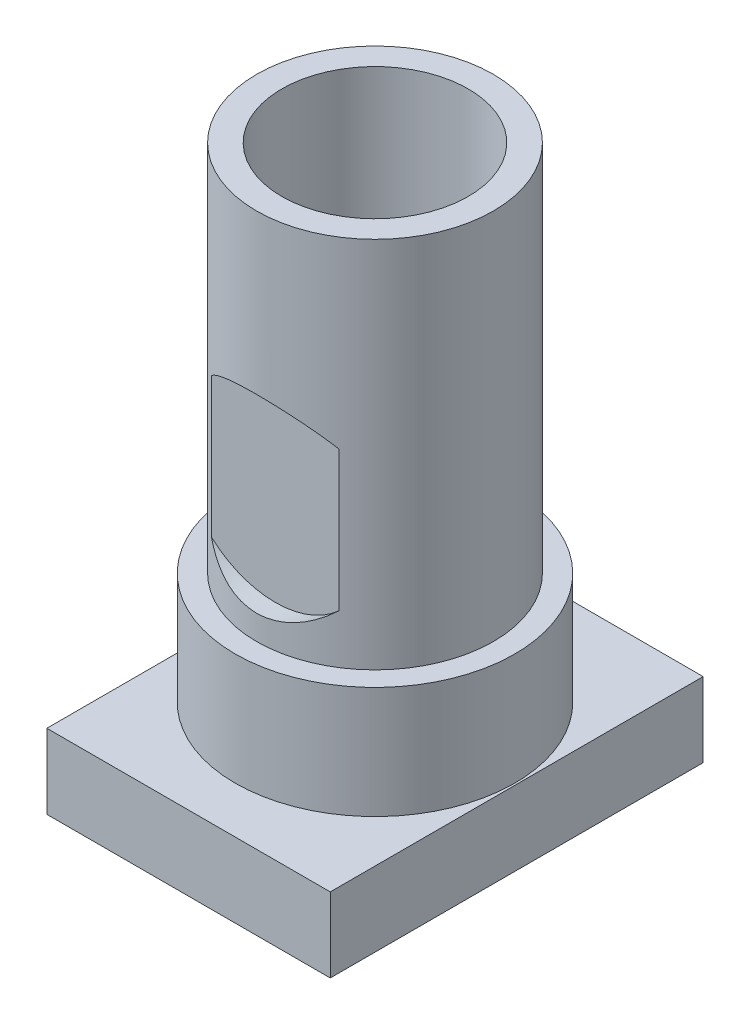
ISO-10303-21;
HEADER;
FILE_DESCRIPTION(('STEP AP214'),'2;1');
FILE_NAME('part.step','',(''),(''),'','','');
FILE_SCHEMA(('AUTOMOTIVE_DESIGN { 1 0 10303 214 1 1 1 1 }'));
ENDSEC;
DATA;
#1=APPLICATION_CONTEXT('core data for automotive mechanical design processes');
#2=APPLICATION_PROTOCOL_DEFINITION('international standard','automotive_design',2000,#1);
#3=PRODUCT_CONTEXT('',#1,'mechanical');
#4=PRODUCT('Part','Part','',(#3));
#5=PRODUCT_RELATED_PRODUCT_CATEGORY('part','',(#4));
#6=PRODUCT_DEFINITION_FORMATION('','',#4);
#7=PRODUCT_DEFINITION_CONTEXT('part definition',#1,'design');
#8=PRODUCT_DEFINITION('design','',#6,#7);
#9=PRODUCT_DEFINITION_SHAPE('','',#8);
#10=(LENGTH_UNIT() NAMED_UNIT(*) SI_UNIT(.MILLI.,.METRE.));
#11=(NAMED_UNIT(*) PLANE_ANGLE_UNIT() SI_UNIT($,.RADIAN.));
#12=(NAMED_UNIT(*) SI_UNIT($,.STERADIAN.) SOLID_ANGLE_UNIT());
#13=UNCERTAINTY_MEASURE_WITH_UNIT(LENGTH_MEASURE(1.E-05),#10,'distance_accuracy_value','');
#14=(GEOMETRIC_REPRESENTATION_CONTEXT(3) GLOBAL_UNCERTAINTY_ASSIGNED_CONTEXT((#13)) GLOBAL_UNIT_ASSIGNED_CONTEXT((#10,
#11,#12)) REPRESENTATION_CONTEXT('',''));
#15=CARTESIAN_POINT('',(0.,0.,0.));
#16=DIRECTION('',(0.,0.,1.));
#17=DIRECTION('',(1.,0.,0.));
#18=AXIS2_PLACEMENT_3D('',#15,#16,#17);
#19=CARTESIAN_POINT('',(0.,5.,0.));
#20=DIRECTION('',(0.,1.,0.));
#21=DIRECTION('',(0.,0.,1.));
#22=AXIS2_PLACEMENT_3D('',#19,#20,#21);
#23=PLANE('',#22);
#24=CARTESIAN_POINT('',(0.,5.,0.));
#25=DIRECTION('',(0.,1.,0.));
#26=DIRECTION('',(0.,0.,1.));
#27=AXIS2_PLACEMENT_3D('',#24,#25,#26);
#28=CIRCLE('',#27,3.75);
#29=CARTESIAN_POINT('',(0.,5.,3.75));
#30=VERTEX_POINT('',#29);
#31=EDGE_CURVE('E230',#30,#30,#28,.T.);
#32=ORIENTED_EDGE('',*,*,#31,.T.);
#33=EDGE_LOOP('',(#32));
#34=FACE_BOUND('',#33,.T.);
#35=CARTESIAN_POINT('',(0.,5.,0.));
#36=DIRECTION('',(0.,1.,0.));
#37=DIRECTION('',(0.,0.,1.));
#38=AXIS2_PLACEMENT_3D('',#35,#36,#37);
#39=CIRCLE('',#38,3.175);
#40=CARTESIAN_POINT('',(0.,5.,3.175));
#41=VERTEX_POINT('',#40);
#42=EDGE_CURVE('E224',#41,#41,#39,.T.);
#43=ORIENTED_EDGE('',*,*,#42,.F.);
#44=EDGE_LOOP('',(#43));
#45=FACE_BOUND('',#44,.T.);
#46=ADVANCED_FACE('F33',(#34,#45),#23,.T.);
#47=CARTESIAN_POINT('',(3.8,2.,-5.));
#48=DIRECTION('',(-1.,0.,0.));
#49=DIRECTION('',(0.,0.,1.));
#50=AXIS2_PLACEMENT_3D('',#47,#48,#49);
#51=PLANE('',#50);
#52=DIRECTION('',(0.,0.,-1.));
#53=VECTOR('',#52,1.);
#54=CARTESIAN_POINT('',(3.8,0.,-5.));
#55=LINE('',#54,#53);
#56=CARTESIAN_POINT('',(3.8,0.,5.));
#57=VERTEX_POINT('',#56);
#58=CARTESIAN_POINT('',(3.8,0.,-5.));
#59=VERTEX_POINT('',#58);
#60=EDGE_CURVE('E189',#57,#59,#55,.T.);
#61=ORIENTED_EDGE('',*,*,#60,.T.);
#62=DIRECTION('',(0.,-1.,0.));
#63=VECTOR('',#62,1.);
#64=CARTESIAN_POINT('',(3.8,2.,-5.));
#65=LINE('',#64,#63);
#66=CARTESIAN_POINT('',(3.8,2.,-5.));
#67=VERTEX_POINT('',#66);
#68=EDGE_CURVE('E183',#67,#59,#65,.T.);
#69=ORIENTED_EDGE('',*,*,#68,.F.);
#70=DIRECTION('',(0.,0.,-1.));
#71=VECTOR('',#70,1.);
#72=CARTESIAN_POINT('',(3.8,2.,-5.));
#73=LINE('',#72,#71);
#74=CARTESIAN_POINT('',(3.8,2.,5.));
#75=VERTEX_POINT('',#74);
#76=EDGE_CURVE('E196',#75,#67,#73,.T.);
#77=ORIENTED_EDGE('',*,*,#76,.F.);
#78=DIRECTION('',(0.,-1.,0.));
#79=VECTOR('',#78,1.);
#80=CARTESIAN_POINT('',(3.8,2.,5.));
#81=LINE('',#80,#79);
#82=EDGE_CURVE('E200',#75,#57,#81,.T.);
#83=ORIENTED_EDGE('',*,*,#82,.T.);
#84=EDGE_LOOP('',(#61,#69,#77,#83));
#85=FACE_BOUND('',#84,.T.);
#86=ADVANCED_FACE('F35',(#85),#51,.F.);
#87=CARTESIAN_POINT('',(-3.8,2.,-5.));
#88=DIRECTION('',(0.,0.,1.));
#89=DIRECTION('',(1.,0.,0.));
#90=AXIS2_PLACEMENT_3D('',#87,#88,#89);
#91=PLANE('',#90);
#92=DIRECTION('',(-1.,0.,0.));
#93=VECTOR('',#92,1.);
#94=CARTESIAN_POINT('',(-3.8,0.,-5.));
#95=LINE('',#94,#93);
#96=CARTESIAN_POINT('',(-3.8,0.,-5.));
#97=VERTEX_POINT('',#96);
#98=EDGE_CURVE('E178',#59,#97,#95,.T.);
#99=ORIENTED_EDGE('',*,*,#98,.T.);
#100=DIRECTION('',(0.,-1.,0.));
#101=VECTOR('',#100,1.);
#102=CARTESIAN_POINT('',(-3.8,2.,-5.));
#103=LINE('',#102,#101);
#104=CARTESIAN_POINT('',(-3.8,2.,-5.));
#105=VERTEX_POINT('',#104);
#106=EDGE_CURVE('E180',#105,#97,#103,.T.);
#107=ORIENTED_EDGE('',*,*,#106,.F.);
#108=DIRECTION('',(-1.,0.,0.));
#109=VECTOR('',#108,1.);
#110=CARTESIAN_POINT('',(-3.8,2.,-5.));
#111=LINE('',#110,#109);
#112=EDGE_CURVE('E85',#67,#105,#111,.T.);
#113=ORIENTED_EDGE('',*,*,#112,.F.);
#114=ORIENTED_EDGE('',*,*,#68,.T.);
#115=EDGE_LOOP('',(#99,#107,#113,#114));
#116=FACE_BOUND('',#115,.T.);
#117=ADVANCED_FACE('F157',(#116),#91,.F.);
#118=CARTESIAN_POINT('',(-3.8,2.,-5.));
#119=DIRECTION('',(1.,0.,0.));
#120=DIRECTION('',(0.,0.,-1.));
#121=AXIS2_PLACEMENT_3D('',#118,#119,#120);
#122=PLANE('',#121);
#123=DIRECTION('',(0.,0.,1.));
#124=VECTOR('',#123,1.);
#125=CARTESIAN_POINT('',(-3.8,0.,-5.));
#126=LINE('',#125,#124);
#127=CARTESIAN_POINT('',(-3.8,0.,5.));
#128=VERTEX_POINT('',#127);
#129=EDGE_CURVE('E188',#97,#128,#126,.T.);
#130=ORIENTED_EDGE('',*,*,#129,.T.);
#131=DIRECTION('',(0.,-1.,0.));
#132=VECTOR('',#131,1.);
#133=CARTESIAN_POINT('',(-3.8,2.,5.));
#134=LINE('',#133,#132);
#135=CARTESIAN_POINT('',(-3.8,2.,5.));
#136=VERTEX_POINT('',#135);
#137=EDGE_CURVE('E193',#136,#128,#134,.T.);
#138=ORIENTED_EDGE('',*,*,#137,.F.);
#139=DIRECTION('',(0.,0.,1.));
#140=VECTOR('',#139,1.);
#141=CARTESIAN_POINT('',(-3.8,2.,-5.));
#142=LINE('',#141,#140);
#143=EDGE_CURVE('E192',#105,#136,#142,.T.);
#144=ORIENTED_EDGE('',*,*,#143,.F.);
#145=ORIENTED_EDGE('',*,*,#106,.T.);
#146=EDGE_LOOP('',(#130,#138,#144,#145));
#147=FACE_BOUND('',#146,.T.);
#148=ADVANCED_FACE('F172',(#147),#122,.F.);
#149=CARTESIAN_POINT('',(-3.8,2.,5.));
#150=DIRECTION('',(0.,0.,-1.));
#151=DIRECTION('',(-1.,0.,0.));
#152=AXIS2_PLACEMENT_3D('',#149,#150,#151);
#153=PLANE('',#152);
#154=DIRECTION('',(1.,0.,0.));
#155=VECTOR('',#154,1.);
#156=CARTESIAN_POINT('',(-3.8,0.,5.));
#157=LINE('',#156,#155);
#158=EDGE_CURVE('E77',#128,#57,#157,.T.);
#159=ORIENTED_EDGE('',*,*,#158,.T.);
#160=ORIENTED_EDGE('',*,*,#82,.F.);
#161=DIRECTION('',(1.,0.,0.));
#162=VECTOR('',#161,1.);
#163=CARTESIAN_POINT('',(-3.8,2.,5.));
#164=LINE('',#163,#162);
#165=EDGE_CURVE('E56',#136,#75,#164,.T.);
#166=ORIENTED_EDGE('',*,*,#165,.F.);
#167=ORIENTED_EDGE('',*,*,#137,.T.);
#168=EDGE_LOOP('',(#159,#160,#166,#167));
#169=FACE_BOUND('',#168,.T.);
#170=ADVANCED_FACE('F165',(#169),#153,.F.);
#171=CARTESIAN_POINT('',(0.,2.,0.));
#172=DIRECTION('',(0.,1.,0.));
#173=DIRECTION('',(0.,0.,1.));
#174=AXIS2_PLACEMENT_3D('',#171,#172,#173);
#175=PLANE('',#174);
#176=CARTESIAN_POINT('',(0.,2.,0.));
#177=DIRECTION('',(0.,1.,0.));
#178=DIRECTION('',(0.,0.,1.));
#179=AXIS2_PLACEMENT_3D('',#176,#177,#178);
#180=CIRCLE('',#179,3.75);
#181=CARTESIAN_POINT('',(0.,2.,3.75));
#182=VERTEX_POINT('',#181);
#183=EDGE_CURVE('E227',#182,#182,#180,.T.);
#184=ORIENTED_EDGE('',*,*,#183,.F.);
#185=EDGE_LOOP('',(#184));
#186=FACE_BOUND('',#185,.T.);
#187=ORIENTED_EDGE('',*,*,#76,.T.);
#188=ORIENTED_EDGE('',*,*,#112,.T.);
#189=ORIENTED_EDGE('',*,*,#143,.T.);
#190=ORIENTED_EDGE('',*,*,#165,.T.);
#191=EDGE_LOOP('',(#187,#188,#189,#190));
#192=FACE_BOUND('',#191,.T.);
#193=ADVANCED_FACE('F162',(#186,#192),#175,.T.);
#194=CARTESIAN_POINT('',(0.,0.,0.));
#195=DIRECTION('',(0.,1.,0.));
#196=DIRECTION('',(0.,0.,1.));
#197=AXIS2_PLACEMENT_3D('',#194,#195,#196);
#198=PLANE('',#197);
#199=CARTESIAN_POINT('',(0.,0.,0.));
#200=DIRECTION('',(0.,1.,0.));
#201=DIRECTION('',(0.,0.,1.));
#202=AXIS2_PLACEMENT_3D('',#199,#200,#201);
#203=CIRCLE('',#202,1.325);
#204=CARTESIAN_POINT('',(0.,0.,1.325));
#205=VERTEX_POINT('',#204);
#206=EDGE_CURVE('E216',#205,#205,#203,.T.);
#207=ORIENTED_EDGE('',*,*,#206,.T.);
#208=EDGE_LOOP('',(#207));
#209=FACE_BOUND('',#208,.T.);
#210=ORIENTED_EDGE('',*,*,#60,.F.);
#211=ORIENTED_EDGE('',*,*,#158,.F.);
#212=ORIENTED_EDGE('',*,*,#129,.F.);
#213=ORIENTED_EDGE('',*,*,#98,.F.);
#214=EDGE_LOOP('',(#210,#211,#212,#213));
#215=FACE_BOUND('',#214,.T.);
#216=ADVANCED_FACE('F146',(#209,#215),#198,.F.);
#217=CARTESIAN_POINT('',(0.,5.,0.));
#218=DIRECTION('',(0.,-1.,0.));
#219=DIRECTION('',(0.,0.,-1.));
#220=AXIS2_PLACEMENT_3D('',#217,#218,#219);
#221=CYLINDRICAL_SURFACE('',#220,3.75);
#222=ORIENTED_EDGE('',*,*,#31,.F.);
#223=EDGE_LOOP('',(#222));
#224=FACE_BOUND('',#223,.T.);
#225=ORIENTED_EDGE('',*,*,#183,.T.);
#226=EDGE_LOOP('',(#225));
#227=FACE_BOUND('',#226,.T.);
#228=ADVANCED_FACE('F139',(#224,#227),#221,.T.);
#229=CARTESIAN_POINT('',(0.,15.,0.));
#230=DIRECTION('',(0.,1.,0.));
#231=DIRECTION('',(0.,0.,1.));
#232=AXIS2_PLACEMENT_3D('',#229,#230,#231);
#233=PLANE('',#232);
#234=CARTESIAN_POINT('',(0.,15.,0.));
#235=DIRECTION('',(0.,1.,0.));
#236=DIRECTION('',(0.,0.,1.));
#237=AXIS2_PLACEMENT_3D('',#234,#235,#236);
#238=CIRCLE('',#237,3.175);
#239=CARTESIAN_POINT('',(0.,15.,3.175));
#240=VERTEX_POINT('',#239);
#241=EDGE_CURVE('E225',#240,#240,#238,.T.);
#242=ORIENTED_EDGE('',*,*,#241,.T.);
#243=EDGE_LOOP('',(#242));
#244=FACE_BOUND('',#243,.T.);
#245=CARTESIAN_POINT('',(0.,15.,0.));
#246=DIRECTION('',(0.,1.,0.));
#247=DIRECTION('',(0.,0.,1.));
#248=AXIS2_PLACEMENT_3D('',#245,#246,#247);
#249=CIRCLE('',#248,2.5);
#250=CARTESIAN_POINT('',(0.,15.,2.5));
#251=VERTEX_POINT('',#250);
#252=EDGE_CURVE('E219',#251,#251,#249,.T.);
#253=ORIENTED_EDGE('',*,*,#252,.F.);
#254=EDGE_LOOP('',(#253));
#255=FACE_BOUND('',#254,.T.);
#256=ADVANCED_FACE('F137',(#244,#255),#233,.T.);
#257=CARTESIAN_POINT('',(0.,15.,0.));
#258=DIRECTION('',(0.,-1.,0.));
#259=DIRECTION('',(0.,0.,-1.));
#260=AXIS2_PLACEMENT_3D('',#257,#258,#259);
#261=CYLINDRICAL_SURFACE('',#260,3.175);
#262=DIRECTION('',(0.,-1.,0.));
#263=VECTOR('',#262,1.);
#264=CARTESIAN_POINT('',(-1.71026313764871,15.,2.675));
#265=LINE('',#264,#263);
#266=CARTESIAN_POINT('',(-1.71026313764871,10.0779243861242,2.675));
#267=VERTEX_POINT('',#266);
#268=CARTESIAN_POINT('',(-1.71026313764871,6.32207561387579,2.675));
#269=VERTEX_POINT('',#268);
#270=EDGE_CURVE('E11',#267,#269,#265,.T.);
#271=ORIENTED_EDGE('',*,*,#270,.F.);
#272=CARTESIAN_POINT('',(-1.71026313764871,10.0779243861242,2.675));
#273=CARTESIAN_POINT('',(-1.66328215739973,10.1207016414058,2.70503764619045));
#274=CARTESIAN_POINT('',(-1.61450557696192,10.1619070627414,2.73447812061696));
#275=CARTESIAN_POINT('',(-1.51333057198159,10.2409720324849,2.79174491436722));
#276=CARTESIAN_POINT('',(-1.46092854727948,10.2788281674552,2.81956957723126));
#277=CARTESIAN_POINT('',(-1.2974564301434,10.3875618960469,2.90035843502918));
#278=CARTESIAN_POINT('',(-1.18092716322214,10.4528613261708,2.95010592541494));
#279=CARTESIAN_POINT('',(-0.934139533696235,10.5658931287609,3.03729690458921));
#280=CARTESIAN_POINT('',(-0.803797934267126,10.6135101813369,3.07465945818045));
#281=CARTESIAN_POINT('',(-0.601599507648685,10.6687164105101,3.11824724596771));
#282=CARTESIAN_POINT('',(-0.533199258405305,10.6844031837712,3.13069059821122));
#283=CARTESIAN_POINT('',(-0.394706228413304,10.7101329716044,3.15114762061601));
#284=CARTESIAN_POINT('',(-0.32461382516096,10.7201772330282,3.15916226940168));
#285=CARTESIAN_POINT('',(-0.133157833541096,10.7394027491319,3.17451214399269));
#286=CARTESIAN_POINT('',(-0.0107735400947524,10.7428928441718,3.17731274531533));
#287=CARTESIAN_POINT('',(0.232684537187481,10.732257943512,3.16880855189651));
#288=CARTESIAN_POINT('',(0.353758102944507,10.7181300606221,3.15750144521896));
#289=CARTESIAN_POINT('',(0.581318256839187,10.6750774412627,3.12328030682657));
#290=CARTESIAN_POINT('',(0.688200212936994,10.6474149732434,3.10135783635245));
#291=CARTESIAN_POINT('',(0.895478031046901,10.579422844346,3.04798874021679));
#292=CARTESIAN_POINT('',(0.995862075439869,10.5390708448385,3.01652532220334));
#293=CARTESIAN_POINT('',(1.20794579838011,10.4380559903321,2.93882120602692));
#294=CARTESIAN_POINT('',(1.317857854332,10.3749400089815,2.89088095718567));
#295=CARTESIAN_POINT('',(1.47265524810264,10.270448436632,2.81340386069412));
#296=CARTESIAN_POINT('',(1.52249265521175,10.2340582796342,2.78670509119492));
#297=CARTESIAN_POINT('',(1.61884925055354,10.158230671007,2.73185188050978));
#298=CARTESIAN_POINT('',(1.66537177511501,10.1187963689686,2.70369895357489));
#299=CARTESIAN_POINT('',(1.71026313764871,10.0779243861242,2.675));
#300=B_SPLINE_CURVE_WITH_KNOTS('',3,(#272,#273,#274,#275,#276,#277,#278,#279,#280,#281,#282,
#283,#284,#285,#286,#287,#288,#289,#290,#291,#292,#293,#294,#295,#296,#297,#298,#299),
.UNSPECIFIED.,.F.,.F.,(4,2,2,2,2,2,2,2,2,2,2,2,2,4),(0.,0.21076431870626,0.421741022099787,
0.84731366457721,1.27561496813452,1.48909065196894,1.70251914453254,2.06769496790647,
2.43293064324698,2.76920238114155,3.10606943670537,3.51072152866186,3.71230020354094,
3.91367304278616),.UNSPECIFIED.);
#301=CARTESIAN_POINT('',(1.71026313764871,10.0779243861242,2.675));
#302=VERTEX_POINT('',#301);
#303=EDGE_CURVE('E103',#267,#302,#300,.T.);
#304=ORIENTED_EDGE('',*,*,#303,.T.);
#305=DIRECTION('',(0.,-1.,0.));
#306=VECTOR('',#305,1.);
#307=CARTESIAN_POINT('',(1.71026313764871,15.,2.675));
#308=LINE('',#307,#306);
#309=CARTESIAN_POINT('',(1.71026313764871,6.32207561387579,2.675));
#310=VERTEX_POINT('',#309);
#311=EDGE_CURVE('E41',#310,#302,#308,.F.);
#312=ORIENTED_EDGE('',*,*,#311,.F.);
#313=CARTESIAN_POINT('',(1.71026313764871,6.32207561387579,2.675));
#314=CARTESIAN_POINT('',(1.66328215739973,6.27929835859421,2.70503764619045));
#315=CARTESIAN_POINT('',(1.61450557696192,6.23809293725865,2.73447812061696));
#316=CARTESIAN_POINT('',(1.51333057198159,6.15902796751513,2.79174491436722));
#317=CARTESIAN_POINT('',(1.46092854727948,6.1211718325448,2.81956957723126));
#318=CARTESIAN_POINT('',(1.2974564301434,6.01243810395307,2.90035843502918));
#319=CARTESIAN_POINT('',(1.18092716322214,5.94713867382922,2.95010592541494));
#320=CARTESIAN_POINT('',(0.934139533696233,5.83410687123913,3.03729690458921));
#321=CARTESIAN_POINT('',(0.803797934267124,5.78648981866312,3.07465945818045));
#322=CARTESIAN_POINT('',(0.601599507648683,5.73128358948986,3.11824724596771));
#323=CARTESIAN_POINT('',(0.533199258405304,5.71559681622882,3.13069059821123));
#324=CARTESIAN_POINT('',(0.394706228413302,5.68986702839561,3.15114762061601));
#325=CARTESIAN_POINT('',(0.324613825160958,5.67982276697183,3.15916226940168));
#326=CARTESIAN_POINT('',(0.133157833541094,5.66059725086811,3.17451214399269));
#327=CARTESIAN_POINT('',(0.01077354009475,5.65710715582819,3.17731274531533));
#328=CARTESIAN_POINT('',(-0.232684537187483,5.66774205648798,3.16880855189651));
#329=CARTESIAN_POINT('',(-0.353758102944509,5.68186993937789,3.15750144521896));
#330=CARTESIAN_POINT('',(-0.581318256839188,5.72492255873732,3.12328030682657));
#331=CARTESIAN_POINT('',(-0.688200212936995,5.75258502675664,3.10135783635245));
#332=CARTESIAN_POINT('',(-0.895478031046902,5.82057715565402,3.04798874021679));
#333=CARTESIAN_POINT('',(-0.99586207543987,5.86092915516148,3.01652532220334));
#334=CARTESIAN_POINT('',(-1.20794579838011,5.96194400966789,2.93882120602692));
#335=CARTESIAN_POINT('',(-1.317857854332,6.02505999101849,2.89088095718567));
#336=CARTESIAN_POINT('',(-1.47265524810264,6.12955156336798,2.81340386069412));
#337=CARTESIAN_POINT('',(-1.52249265521175,6.16594172036578,2.78670509119492));
#338=CARTESIAN_POINT('',(-1.61884925055354,6.24176932899301,2.73185188050978));
#339=CARTESIAN_POINT('',(-1.66537177511501,6.28120363103137,2.70369895357489));
#340=CARTESIAN_POINT('',(-1.71026313764871,6.32207561387579,2.675));
#341=B_SPLINE_CURVE_WITH_KNOTS('',3,(#313,#314,#315,#316,#317,#318,#319,#320,#321,#322,#323,
#324,#325,#326,#327,#328,#329,#330,#331,#332,#333,#334,#335,#336,#337,#338,#339,#340),
.UNSPECIFIED.,.F.,.F.,(4,2,2,2,2,2,2,2,2,2,2,2,2,4),(0.,0.21076431870626,0.421741022099788,
0.847313664577211,1.27561496813452,1.48909065196894,1.70251914453254,2.06769496790647,
2.43293064324698,2.76920238114155,3.10606943670537,3.51072152866186,3.71230020354094,
3.91367304278616),.UNSPECIFIED.);
#342=EDGE_CURVE('E47',#310,#269,#341,.T.);
#343=ORIENTED_EDGE('',*,*,#342,.T.);
#344=EDGE_LOOP('',(#271,#304,#312,#343));
#345=FACE_BOUND('',#344,.T.);
#346=ORIENTED_EDGE('',*,*,#241,.F.);
#347=EDGE_LOOP('',(#346));
#348=FACE_BOUND('',#347,.T.);
#349=ORIENTED_EDGE('',*,*,#42,.T.);
#350=EDGE_LOOP('',(#349));
#351=FACE_BOUND('',#350,.T.);
#352=ADVANCED_FACE('F108',(#345,#348,#351),#261,.T.);
#353=CARTESIAN_POINT('',(0.,2.,0.));
#354=DIRECTION('',(0.,1.,0.));
#355=DIRECTION('',(0.,0.,1.));
#356=AXIS2_PLACEMENT_3D('',#353,#354,#355);
#357=CIRCLE('',#356,1.325);
#358=CARTESIAN_POINT('',(0.,2.,1.325));
#359=VERTEX_POINT('',#358);
#360=EDGE_CURVE('E106',#359,#359,#357,.T.);
#361=ORIENTED_EDGE('',*,*,#360,.F.);
#362=EDGE_LOOP('',(#361));
#363=FACE_BOUND('',#362,.T.);
#364=CARTESIAN_POINT('',(0.,2.,0.));
#365=DIRECTION('',(0.,1.,0.));
#366=DIRECTION('',(0.,0.,1.));
#367=AXIS2_PLACEMENT_3D('',#364,#365,#366);
#368=CIRCLE('',#367,2.5);
#369=CARTESIAN_POINT('',(0.,2.,2.5));
#370=VERTEX_POINT('',#369);
#371=EDGE_CURVE('E111',#370,#370,#368,.F.);
#372=ORIENTED_EDGE('',*,*,#371,.F.);
#373=EDGE_LOOP('',(#372));
#374=FACE_BOUND('',#373,.T.);
#375=ADVANCED_FACE('F145',(#363,#374),#175,.T.);
#376=CARTESIAN_POINT('',(0.,5.,0.));
#377=DIRECTION('',(0.,-1.,0.));
#378=DIRECTION('',(0.,0.,-1.));
#379=AXIS2_PLACEMENT_3D('',#376,#377,#378);
#380=CYLINDRICAL_SURFACE('',#379,2.5);
#381=ORIENTED_EDGE('',*,*,#371,.T.);
#382=EDGE_LOOP('',(#381));
#383=FACE_BOUND('',#382,.T.);
#384=ORIENTED_EDGE('',*,*,#252,.T.);
#385=EDGE_LOOP('',(#384));
#386=FACE_BOUND('',#385,.T.);
#387=ADVANCED_FACE('F135',(#383,#386),#380,.F.);
#388=CARTESIAN_POINT('',(0.,0.,0.));
#389=DIRECTION('',(0.,1.,0.));
#390=DIRECTION('',(0.,0.,1.));
#391=AXIS2_PLACEMENT_3D('',#388,#389,#390);
#392=CYLINDRICAL_SURFACE('',#391,1.325);
#393=ORIENTED_EDGE('',*,*,#206,.F.);
#394=EDGE_LOOP('',(#393));
#395=FACE_BOUND('',#394,.T.);
#396=ORIENTED_EDGE('',*,*,#360,.T.);
#397=EDGE_LOOP('',(#396));
#398=FACE_BOUND('',#397,.T.);
#399=ADVANCED_FACE('F132',(#395,#398),#392,.F.);
#400=CARTESIAN_POINT('',(0.,8.2,2.675));
#401=DIRECTION('',(0.,0.,1.));
#402=DIRECTION('',(1.,0.,0.));
#403=AXIS2_PLACEMENT_3D('',#400,#401,#402);
#404=CYLINDRICAL_SURFACE('',#403,2.54);
#405=CARTESIAN_POINT('',(0.,8.2,2.675));
#406=DIRECTION('',(0.,0.,1.));
#407=DIRECTION('',(1.,0.,0.));
#408=AXIS2_PLACEMENT_3D('',#405,#406,#407);
#409=CIRCLE('',#408,2.54);
#410=EDGE_CURVE('E98',#302,#267,#409,.T.);
#411=ORIENTED_EDGE('',*,*,#410,.F.);
#412=ORIENTED_EDGE('',*,*,#303,.F.);
#413=EDGE_LOOP('',(#411,#412));
#414=FACE_BOUND('',#413,.T.);
#415=ADVANCED_FACE('F105',(#414),#404,.F.);
#416=EDGE_CURVE('E100',#269,#310,#409,.T.);
#417=ORIENTED_EDGE('',*,*,#416,.F.);
#418=ORIENTED_EDGE('',*,*,#342,.F.);
#419=EDGE_LOOP('',(#417,#418));
#420=FACE_BOUND('',#419,.T.);
#421=ADVANCED_FACE('F131',(#420),#404,.F.);
#422=CARTESIAN_POINT('',(0.,8.2,2.675));
#423=DIRECTION('',(0.,0.,1.));
#424=DIRECTION('',(1.,0.,0.));
#425=AXIS2_PLACEMENT_3D('',#422,#423,#424);
#426=PLANE('',#425);
#427=ORIENTED_EDGE('',*,*,#270,.T.);
#428=ORIENTED_EDGE('',*,*,#416,.T.);
#429=ORIENTED_EDGE('',*,*,#311,.T.);
#430=ORIENTED_EDGE('',*,*,#410,.T.);
#431=EDGE_LOOP('',(#427,#428,#429,#430));
#432=FACE_BOUND('',#431,.T.);
#433=ADVANCED_FACE('F97',(#432),#426,.T.);
#434=CLOSED_SHELL('',(#46,#86,#117,#148,#170,#193,#216,#228,#256,#352,#375,#387,#399,#415,#421,#433));
#435=MANIFOLD_SOLID_BREP('B2',#434);
#436=ADVANCED_BREP_SHAPE_REPRESENTATION('',(#18,#435),#14);
#437=SHAPE_DEFINITION_REPRESENTATION(#9,#436);
ENDSEC;
END-ISO-10303-21;
